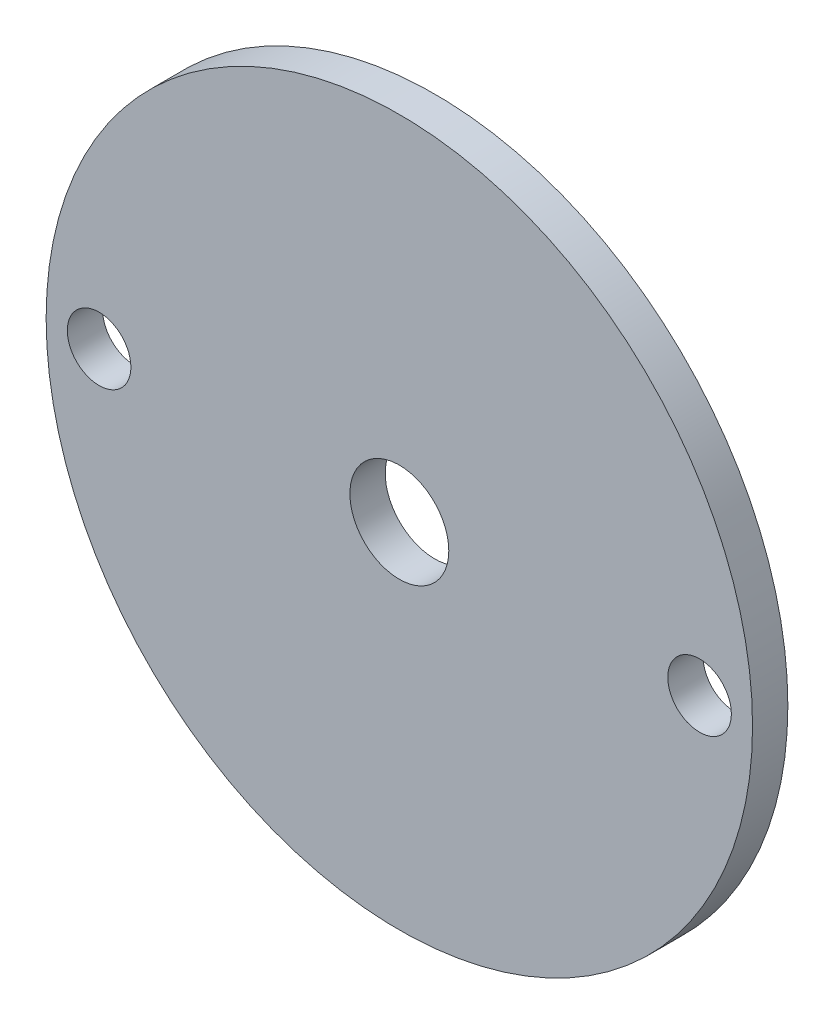
ISO-10303-21;
HEADER;
FILE_DESCRIPTION(('STEP AP214'),'2;1');
FILE_NAME('part.step','',(''),(''),'','','');
FILE_SCHEMA(('AUTOMOTIVE_DESIGN { 1 0 10303 214 1 1 1 1 }'));
ENDSEC;
DATA;
#1=APPLICATION_CONTEXT('core data for automotive mechanical design processes');
#2=APPLICATION_PROTOCOL_DEFINITION('international standard','automotive_design',2000,#1);
#3=PRODUCT_CONTEXT('',#1,'mechanical');
#4=PRODUCT('Part','Part','',(#3));
#5=PRODUCT_RELATED_PRODUCT_CATEGORY('part','',(#4));
#6=PRODUCT_DEFINITION_FORMATION('','',#4);
#7=PRODUCT_DEFINITION_CONTEXT('part definition',#1,'design');
#8=PRODUCT_DEFINITION('design','',#6,#7);
#9=PRODUCT_DEFINITION_SHAPE('','',#8);
#10=(LENGTH_UNIT() NAMED_UNIT(*) SI_UNIT(.MILLI.,.METRE.));
#11=(NAMED_UNIT(*) PLANE_ANGLE_UNIT() SI_UNIT($,.RADIAN.));
#12=(NAMED_UNIT(*) SI_UNIT($,.STERADIAN.) SOLID_ANGLE_UNIT());
#13=UNCERTAINTY_MEASURE_WITH_UNIT(LENGTH_MEASURE(1.E-05),#10,'distance_accuracy_value','');
#14=(GEOMETRIC_REPRESENTATION_CONTEXT(3) GLOBAL_UNCERTAINTY_ASSIGNED_CONTEXT((#13)) GLOBAL_UNIT_ASSIGNED_CONTEXT((#10,
#11,#12)) REPRESENTATION_CONTEXT('',''));
#15=CARTESIAN_POINT('',(0.,0.,0.));
#16=DIRECTION('',(0.,0.,1.));
#17=DIRECTION('',(1.,0.,0.));
#18=AXIS2_PLACEMENT_3D('',#15,#16,#17);
#19=CARTESIAN_POINT('',(0.,0.,5.));
#20=DIRECTION('',(0.,0.,1.));
#21=DIRECTION('',(1.,0.,0.));
#22=AXIS2_PLACEMENT_3D('',#19,#20,#21);
#23=PLANE('',#22);
#24=CARTESIAN_POINT('',(-42.5,0.,5.));
#25=DIRECTION('',(0.,0.,1.));
#26=DIRECTION('',(1.,0.,0.));
#27=AXIS2_PLACEMENT_3D('',#24,#25,#26);
#28=CIRCLE('',#27,4.5);
#29=CARTESIAN_POINT('',(-38.,0.,5.));
#30=VERTEX_POINT('',#29);
#31=EDGE_CURVE('E72',#30,#30,#28,.T.);
#32=ORIENTED_EDGE('',*,*,#31,.F.);
#33=EDGE_LOOP('',(#32));
#34=FACE_BOUND('',#33,.T.);
#35=CARTESIAN_POINT('',(42.5,0.,5.));
#36=DIRECTION('',(0.,0.,1.));
#37=DIRECTION('',(1.,0.,0.));
#38=AXIS2_PLACEMENT_3D('',#35,#36,#37);
#39=CIRCLE('',#38,4.5);
#40=CARTESIAN_POINT('',(47.,0.,5.));
#41=VERTEX_POINT('',#40);
#42=EDGE_CURVE('E66',#41,#41,#39,.T.);
#43=ORIENTED_EDGE('',*,*,#42,.F.);
#44=EDGE_LOOP('',(#43));
#45=FACE_BOUND('',#44,.T.);
#46=CARTESIAN_POINT('',(0.,0.,5.));
#47=DIRECTION('',(0.,0.,1.));
#48=DIRECTION('',(1.,0.,0.));
#49=AXIS2_PLACEMENT_3D('',#46,#47,#48);
#50=CIRCLE('',#49,50.);
#51=CARTESIAN_POINT('',(50.,0.,5.));
#52=VERTEX_POINT('',#51);
#53=EDGE_CURVE('E12',#52,#52,#50,.T.);
#54=ORIENTED_EDGE('',*,*,#53,.T.);
#55=EDGE_LOOP('',(#54));
#56=FACE_BOUND('',#55,.T.);
#57=CARTESIAN_POINT('',(0.,0.,5.));
#58=DIRECTION('',(0.,0.,1.));
#59=DIRECTION('',(1.,0.,0.));
#60=AXIS2_PLACEMENT_3D('',#57,#58,#59);
#61=CIRCLE('',#60,7.);
#62=CARTESIAN_POINT('',(7.,0.,5.));
#63=VERTEX_POINT('',#62);
#64=EDGE_CURVE('E58',#63,#63,#61,.T.);
#65=ORIENTED_EDGE('',*,*,#64,.F.);
#66=EDGE_LOOP('',(#65));
#67=FACE_BOUND('',#66,.T.);
#68=ADVANCED_FACE('F47',(#34,#45,#56,#67),#23,.T.);
#69=CARTESIAN_POINT('',(0.,0.,0.));
#70=DIRECTION('',(0.,0.,1.));
#71=DIRECTION('',(1.,0.,0.));
#72=AXIS2_PLACEMENT_3D('',#69,#70,#71);
#73=PLANE('',#72);
#74=CARTESIAN_POINT('',(-42.5,0.,0.));
#75=DIRECTION('',(0.,0.,1.));
#76=DIRECTION('',(1.,0.,0.));
#77=AXIS2_PLACEMENT_3D('',#74,#75,#76);
#78=CIRCLE('',#77,4.5);
#79=CARTESIAN_POINT('',(-38.,0.,0.));
#80=VERTEX_POINT('',#79);
#81=EDGE_CURVE('E63',#80,#80,#78,.T.);
#82=ORIENTED_EDGE('',*,*,#81,.T.);
#83=EDGE_LOOP('',(#82));
#84=FACE_BOUND('',#83,.T.);
#85=CARTESIAN_POINT('',(42.5,0.,0.));
#86=DIRECTION('',(0.,0.,1.));
#87=DIRECTION('',(1.,0.,0.));
#88=AXIS2_PLACEMENT_3D('',#85,#86,#87);
#89=CIRCLE('',#88,4.5);
#90=CARTESIAN_POINT('',(47.,0.,0.));
#91=VERTEX_POINT('',#90);
#92=EDGE_CURVE('E69',#91,#91,#89,.T.);
#93=ORIENTED_EDGE('',*,*,#92,.T.);
#94=EDGE_LOOP('',(#93));
#95=FACE_BOUND('',#94,.T.);
#96=CARTESIAN_POINT('',(0.,0.,0.));
#97=DIRECTION('',(0.,0.,1.));
#98=DIRECTION('',(1.,0.,0.));
#99=AXIS2_PLACEMENT_3D('',#96,#97,#98);
#100=CIRCLE('',#99,50.);
#101=CARTESIAN_POINT('',(50.,0.,0.));
#102=VERTEX_POINT('',#101);
#103=EDGE_CURVE('E51',#102,#102,#100,.T.);
#104=ORIENTED_EDGE('',*,*,#103,.F.);
#105=EDGE_LOOP('',(#104));
#106=FACE_BOUND('',#105,.T.);
#107=CARTESIAN_POINT('',(0.,0.,0.));
#108=DIRECTION('',(0.,0.,1.));
#109=DIRECTION('',(1.,0.,0.));
#110=AXIS2_PLACEMENT_3D('',#107,#108,#109);
#111=CIRCLE('',#110,7.);
#112=CARTESIAN_POINT('',(7.,0.,0.));
#113=VERTEX_POINT('',#112);
#114=EDGE_CURVE('E60',#113,#113,#111,.T.);
#115=ORIENTED_EDGE('',*,*,#114,.T.);
#116=EDGE_LOOP('',(#115));
#117=FACE_BOUND('',#116,.T.);
#118=ADVANCED_FACE('F78',(#84,#95,#106,#117),#73,.F.);
#119=CARTESIAN_POINT('',(0.,0.,5.));
#120=DIRECTION('',(0.,0.,-1.));
#121=DIRECTION('',(-1.,0.,0.));
#122=AXIS2_PLACEMENT_3D('',#119,#120,#121);
#123=CYLINDRICAL_SURFACE('',#122,50.);
#124=ORIENTED_EDGE('',*,*,#53,.F.);
#125=EDGE_LOOP('',(#124));
#126=FACE_BOUND('',#125,.T.);
#127=ORIENTED_EDGE('',*,*,#103,.T.);
#128=EDGE_LOOP('',(#127));
#129=FACE_BOUND('',#128,.T.);
#130=ADVANCED_FACE('F49',(#126,#129),#123,.T.);
#131=CARTESIAN_POINT('',(0.,0.,5.));
#132=DIRECTION('',(0.,0.,-1.));
#133=DIRECTION('',(-1.,0.,0.));
#134=AXIS2_PLACEMENT_3D('',#131,#132,#133);
#135=CYLINDRICAL_SURFACE('',#134,7.);
#136=ORIENTED_EDGE('',*,*,#64,.T.);
#137=EDGE_LOOP('',(#136));
#138=FACE_BOUND('',#137,.T.);
#139=ORIENTED_EDGE('',*,*,#114,.F.);
#140=EDGE_LOOP('',(#139));
#141=FACE_BOUND('',#140,.T.);
#142=ADVANCED_FACE('F95',(#138,#141),#135,.F.);
#143=CARTESIAN_POINT('',(42.5,0.,0.));
#144=DIRECTION('',(0.,0.,1.));
#145=DIRECTION('',(1.,0.,0.));
#146=AXIS2_PLACEMENT_3D('',#143,#144,#145);
#147=CYLINDRICAL_SURFACE('',#146,4.5);
#148=ORIENTED_EDGE('',*,*,#92,.F.);
#149=EDGE_LOOP('',(#148));
#150=FACE_BOUND('',#149,.T.);
#151=ORIENTED_EDGE('',*,*,#42,.T.);
#152=EDGE_LOOP('',(#151));
#153=FACE_BOUND('',#152,.T.);
#154=ADVANCED_FACE('F84',(#150,#153),#147,.F.);
#155=CARTESIAN_POINT('',(-42.5,0.,0.));
#156=DIRECTION('',(0.,0.,1.));
#157=DIRECTION('',(1.,0.,0.));
#158=AXIS2_PLACEMENT_3D('',#155,#156,#157);
#159=CYLINDRICAL_SURFACE('',#158,4.5);
#160=ORIENTED_EDGE('',*,*,#81,.F.);
#161=EDGE_LOOP('',(#160));
#162=FACE_BOUND('',#161,.T.);
#163=ORIENTED_EDGE('',*,*,#31,.T.);
#164=EDGE_LOOP('',(#163));
#165=FACE_BOUND('',#164,.T.);
#166=ADVANCED_FACE('F81',(#162,#165),#159,.F.);
#167=CLOSED_SHELL('',(#68,#118,#130,#142,#154,#166));
#168=MANIFOLD_SOLID_BREP('B2',#167);
#169=ADVANCED_BREP_SHAPE_REPRESENTATION('',(#18,#168),#14);
#170=SHAPE_DEFINITION_REPRESENTATION(#9,#169);
ENDSEC;
END-ISO-10303-21;
